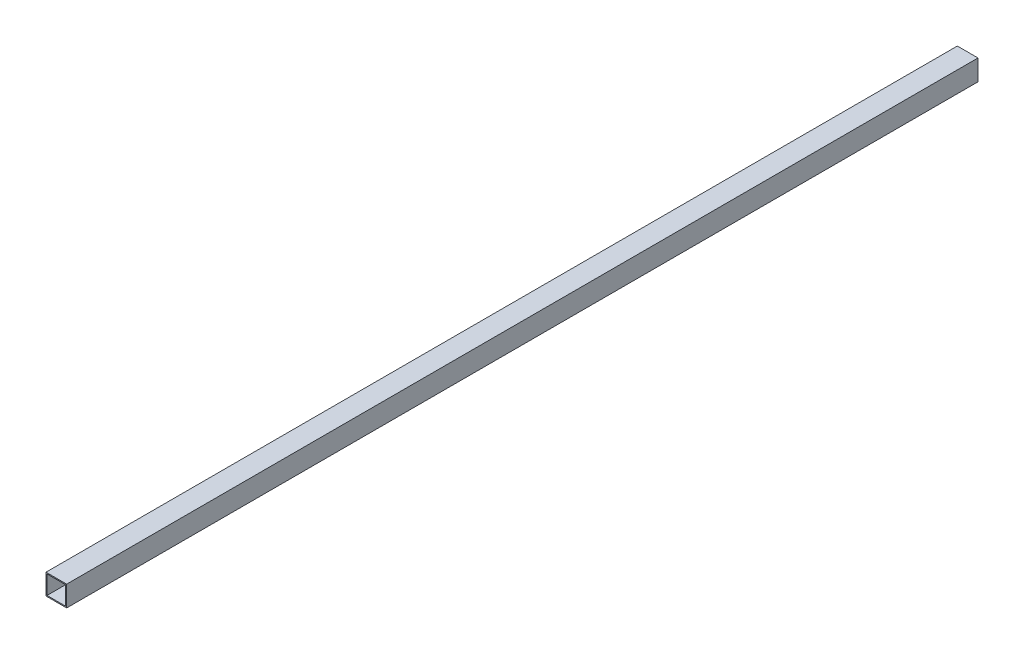
ISO-10303-21;
HEADER;
FILE_DESCRIPTION(('STEP AP214'),'2;1');
FILE_NAME('part.step','',(''),(''),'','','');
FILE_SCHEMA(('AUTOMOTIVE_DESIGN { 1 0 10303 214 1 1 1 1 }'));
ENDSEC;
DATA;
#1=APPLICATION_CONTEXT('core data for automotive mechanical design processes');
#2=APPLICATION_PROTOCOL_DEFINITION('international standard','automotive_design',2000,#1);
#3=PRODUCT_CONTEXT('',#1,'mechanical');
#4=PRODUCT('Part','Part','',(#3));
#5=PRODUCT_RELATED_PRODUCT_CATEGORY('part','',(#4));
#6=PRODUCT_DEFINITION_FORMATION('','',#4);
#7=PRODUCT_DEFINITION_CONTEXT('part definition',#1,'design');
#8=PRODUCT_DEFINITION('design','',#6,#7);
#9=PRODUCT_DEFINITION_SHAPE('','',#8);
#10=(LENGTH_UNIT() NAMED_UNIT(*) SI_UNIT(.MILLI.,.METRE.));
#11=(NAMED_UNIT(*) PLANE_ANGLE_UNIT() SI_UNIT($,.RADIAN.));
#12=(NAMED_UNIT(*) SI_UNIT($,.STERADIAN.) SOLID_ANGLE_UNIT());
#13=UNCERTAINTY_MEASURE_WITH_UNIT(LENGTH_MEASURE(1.E-05),#10,'distance_accuracy_value','');
#14=(GEOMETRIC_REPRESENTATION_CONTEXT(3) GLOBAL_UNCERTAINTY_ASSIGNED_CONTEXT((#13)) GLOBAL_UNIT_ASSIGNED_CONTEXT((#10,
#11,#12)) REPRESENTATION_CONTEXT('',''));
#15=CARTESIAN_POINT('',(0.,0.,0.));
#16=DIRECTION('',(0.,0.,1.));
#17=DIRECTION('',(1.,0.,0.));
#18=AXIS2_PLACEMENT_3D('',#15,#16,#17);
#19=CARTESIAN_POINT('',(0.,0.,1400.));
#20=DIRECTION('',(0.,0.,1.));
#21=DIRECTION('',(1.,0.,0.));
#22=AXIS2_PLACEMENT_3D('',#19,#20,#21);
#23=PLANE('',#22);
#24=DIRECTION('',(0.,1.,0.));
#25=VECTOR('',#24,1.);
#26=CARTESIAN_POINT('',(15.875,15.875,1400.));
#27=LINE('',#26,#25);
#28=CARTESIAN_POINT('',(15.875,-15.875,1400.));
#29=VERTEX_POINT('',#28);
#30=CARTESIAN_POINT('',(15.875,15.875,1400.));
#31=VERTEX_POINT('',#30);
#32=EDGE_CURVE('E134',#29,#31,#27,.T.);
#33=ORIENTED_EDGE('',*,*,#32,.T.);
#34=DIRECTION('',(-1.,0.,0.));
#35=VECTOR('',#34,1.);
#36=CARTESIAN_POINT('',(-15.875,15.875,1400.));
#37=LINE('',#36,#35);
#38=CARTESIAN_POINT('',(-15.875,15.875,1400.));
#39=VERTEX_POINT('',#38);
#40=EDGE_CURVE('E137',#31,#39,#37,.T.);
#41=ORIENTED_EDGE('',*,*,#40,.T.);
#42=DIRECTION('',(0.,-1.,0.));
#43=VECTOR('',#42,1.);
#44=CARTESIAN_POINT('',(-15.875,15.875,1400.));
#45=LINE('',#44,#43);
#46=CARTESIAN_POINT('',(-15.875,-15.875,1400.));
#47=VERTEX_POINT('',#46);
#48=EDGE_CURVE('E140',#39,#47,#45,.T.);
#49=ORIENTED_EDGE('',*,*,#48,.T.);
#50=DIRECTION('',(1.,0.,0.));
#51=VECTOR('',#50,1.);
#52=CARTESIAN_POINT('',(-15.875,-15.875,1400.));
#53=LINE('',#52,#51);
#54=EDGE_CURVE('E142',#47,#29,#53,.T.);
#55=ORIENTED_EDGE('',*,*,#54,.T.);
#56=EDGE_LOOP('',(#33,#41,#49,#55));
#57=FACE_BOUND('',#56,.T.);
#58=DIRECTION('',(-1.,0.,0.));
#59=VECTOR('',#58,1.);
#60=CARTESIAN_POINT('',(-14.2875,14.2875,1400.));
#61=LINE('',#60,#59);
#62=CARTESIAN_POINT('',(14.2875,14.2875,1400.));
#63=VERTEX_POINT('',#62);
#64=CARTESIAN_POINT('',(-14.2875,14.2875,1400.));
#65=VERTEX_POINT('',#64);
#66=EDGE_CURVE('E106',#63,#65,#61,.T.);
#67=ORIENTED_EDGE('',*,*,#66,.F.);
#68=DIRECTION('',(0.,1.,0.));
#69=VECTOR('',#68,1.);
#70=CARTESIAN_POINT('',(14.2875,14.2875,1400.));
#71=LINE('',#70,#69);
#72=CARTESIAN_POINT('',(14.2875,-14.2875,1400.));
#73=VERTEX_POINT('',#72);
#74=EDGE_CURVE('E98',#73,#63,#71,.T.);
#75=ORIENTED_EDGE('',*,*,#74,.F.);
#76=DIRECTION('',(1.,0.,0.));
#77=VECTOR('',#76,1.);
#78=CARTESIAN_POINT('',(-14.2875,-14.2875,1400.));
#79=LINE('',#78,#77);
#80=CARTESIAN_POINT('',(-14.2875,-14.2875,1400.));
#81=VERTEX_POINT('',#80);
#82=EDGE_CURVE('E120',#81,#73,#79,.T.);
#83=ORIENTED_EDGE('',*,*,#82,.F.);
#84=DIRECTION('',(0.,-1.,0.));
#85=VECTOR('',#84,1.);
#86=CARTESIAN_POINT('',(-14.2875,14.2875,1400.));
#87=LINE('',#86,#85);
#88=EDGE_CURVE('E118',#65,#81,#87,.T.);
#89=ORIENTED_EDGE('',*,*,#88,.F.);
#90=EDGE_LOOP('',(#67,#75,#83,#89));
#91=FACE_BOUND('',#90,.T.);
#92=ADVANCED_FACE('F33',(#57,#91),#23,.T.);
#93=CARTESIAN_POINT('',(0.,0.,0.));
#94=DIRECTION('',(0.,0.,1.));
#95=DIRECTION('',(1.,0.,0.));
#96=AXIS2_PLACEMENT_3D('',#93,#94,#95);
#97=PLANE('',#96);
#98=DIRECTION('',(0.,1.,0.));
#99=VECTOR('',#98,1.);
#100=CARTESIAN_POINT('',(15.875,15.875,0.));
#101=LINE('',#100,#99);
#102=CARTESIAN_POINT('',(15.875,-15.875,0.));
#103=VERTEX_POINT('',#102);
#104=CARTESIAN_POINT('',(15.875,15.875,0.));
#105=VERTEX_POINT('',#104);
#106=EDGE_CURVE('E114',#103,#105,#101,.T.);
#107=ORIENTED_EDGE('',*,*,#106,.F.);
#108=DIRECTION('',(1.,0.,0.));
#109=VECTOR('',#108,1.);
#110=CARTESIAN_POINT('',(-15.875,-15.875,0.));
#111=LINE('',#110,#109);
#112=CARTESIAN_POINT('',(-15.875,-15.875,0.));
#113=VERTEX_POINT('',#112);
#114=EDGE_CURVE('E138',#113,#103,#111,.T.);
#115=ORIENTED_EDGE('',*,*,#114,.F.);
#116=DIRECTION('',(0.,-1.,0.));
#117=VECTOR('',#116,1.);
#118=CARTESIAN_POINT('',(-15.875,15.875,0.));
#119=LINE('',#118,#117);
#120=CARTESIAN_POINT('',(-15.875,15.875,0.));
#121=VERTEX_POINT('',#120);
#122=EDGE_CURVE('E149',#121,#113,#119,.T.);
#123=ORIENTED_EDGE('',*,*,#122,.F.);
#124=DIRECTION('',(-1.,0.,0.));
#125=VECTOR('',#124,1.);
#126=CARTESIAN_POINT('',(-15.875,15.875,0.));
#127=LINE('',#126,#125);
#128=EDGE_CURVE('E147',#105,#121,#127,.T.);
#129=ORIENTED_EDGE('',*,*,#128,.F.);
#130=EDGE_LOOP('',(#107,#115,#123,#129));
#131=FACE_BOUND('',#130,.T.);
#132=DIRECTION('',(0.,1.,0.));
#133=VECTOR('',#132,1.);
#134=CARTESIAN_POINT('',(14.2875,14.2875,0.));
#135=LINE('',#134,#133);
#136=CARTESIAN_POINT('',(14.2875,-14.2875,0.));
#137=VERTEX_POINT('',#136);
#138=CARTESIAN_POINT('',(14.2875,14.2875,0.));
#139=VERTEX_POINT('',#138);
#140=EDGE_CURVE('E56',#137,#139,#135,.T.);
#141=ORIENTED_EDGE('',*,*,#140,.T.);
#142=DIRECTION('',(-1.,0.,0.));
#143=VECTOR('',#142,1.);
#144=CARTESIAN_POINT('',(-14.2875,14.2875,0.));
#145=LINE('',#144,#143);
#146=CARTESIAN_POINT('',(-14.2875,14.2875,0.));
#147=VERTEX_POINT('',#146);
#148=EDGE_CURVE('E113',#139,#147,#145,.T.);
#149=ORIENTED_EDGE('',*,*,#148,.T.);
#150=DIRECTION('',(0.,-1.,0.));
#151=VECTOR('',#150,1.);
#152=CARTESIAN_POINT('',(-14.2875,14.2875,0.));
#153=LINE('',#152,#151);
#154=CARTESIAN_POINT('',(-14.2875,-14.2875,0.));
#155=VERTEX_POINT('',#154);
#156=EDGE_CURVE('E126',#147,#155,#153,.T.);
#157=ORIENTED_EDGE('',*,*,#156,.T.);
#158=DIRECTION('',(1.,0.,0.));
#159=VECTOR('',#158,1.);
#160=CARTESIAN_POINT('',(-14.2875,-14.2875,0.));
#161=LINE('',#160,#159);
#162=EDGE_CURVE('E107',#155,#137,#161,.T.);
#163=ORIENTED_EDGE('',*,*,#162,.T.);
#164=EDGE_LOOP('',(#141,#149,#157,#163));
#165=FACE_BOUND('',#164,.T.);
#166=ADVANCED_FACE('F167',(#131,#165),#97,.F.);
#167=CARTESIAN_POINT('',(15.875,15.875,1400.));
#168=DIRECTION('',(-1.,0.,0.));
#169=DIRECTION('',(0.,-1.,0.));
#170=AXIS2_PLACEMENT_3D('',#167,#168,#169);
#171=PLANE('',#170);
#172=ORIENTED_EDGE('',*,*,#106,.T.);
#173=DIRECTION('',(0.,0.,-1.));
#174=VECTOR('',#173,1.);
#175=CARTESIAN_POINT('',(15.875,15.875,1400.));
#176=LINE('',#175,#174);
#177=EDGE_CURVE('E11',#31,#105,#176,.T.);
#178=ORIENTED_EDGE('',*,*,#177,.F.);
#179=ORIENTED_EDGE('',*,*,#32,.F.);
#180=DIRECTION('',(0.,0.,-1.));
#181=VECTOR('',#180,1.);
#182=CARTESIAN_POINT('',(15.875,-15.875,1400.));
#183=LINE('',#182,#181);
#184=EDGE_CURVE('E144',#29,#103,#183,.T.);
#185=ORIENTED_EDGE('',*,*,#184,.T.);
#186=EDGE_LOOP('',(#172,#178,#179,#185));
#187=FACE_BOUND('',#186,.T.);
#188=ADVANCED_FACE('F35',(#187),#171,.F.);
#189=CARTESIAN_POINT('',(-15.875,15.875,1400.));
#190=DIRECTION('',(0.,-1.,0.));
#191=DIRECTION('',(0.,0.,-1.));
#192=AXIS2_PLACEMENT_3D('',#189,#190,#191);
#193=PLANE('',#192);
#194=ORIENTED_EDGE('',*,*,#128,.T.);
#195=DIRECTION('',(0.,0.,-1.));
#196=VECTOR('',#195,1.);
#197=CARTESIAN_POINT('',(-15.875,15.875,1400.));
#198=LINE('',#197,#196);
#199=EDGE_CURVE('E41',#39,#121,#198,.T.);
#200=ORIENTED_EDGE('',*,*,#199,.F.);
#201=ORIENTED_EDGE('',*,*,#40,.F.);
#202=ORIENTED_EDGE('',*,*,#177,.T.);
#203=EDGE_LOOP('',(#194,#200,#201,#202));
#204=FACE_BOUND('',#203,.T.);
#205=ADVANCED_FACE('F177',(#204),#193,.F.);
#206=CARTESIAN_POINT('',(-15.875,15.875,1400.));
#207=DIRECTION('',(1.,0.,0.));
#208=DIRECTION('',(0.,0.,-1.));
#209=AXIS2_PLACEMENT_3D('',#206,#207,#208);
#210=PLANE('',#209);
#211=ORIENTED_EDGE('',*,*,#122,.T.);
#212=DIRECTION('',(0.,0.,-1.));
#213=VECTOR('',#212,1.);
#214=CARTESIAN_POINT('',(-15.875,-15.875,1400.));
#215=LINE('',#214,#213);
#216=EDGE_CURVE('E154',#47,#113,#215,.T.);
#217=ORIENTED_EDGE('',*,*,#216,.F.);
#218=ORIENTED_EDGE('',*,*,#48,.F.);
#219=ORIENTED_EDGE('',*,*,#199,.T.);
#220=EDGE_LOOP('',(#211,#217,#218,#219));
#221=FACE_BOUND('',#220,.T.);
#222=ADVANCED_FACE('F161',(#221),#210,.F.);
#223=CARTESIAN_POINT('',(-15.875,-15.875,1400.));
#224=DIRECTION('',(0.,1.,0.));
#225=DIRECTION('',(0.,0.,1.));
#226=AXIS2_PLACEMENT_3D('',#223,#224,#225);
#227=PLANE('',#226);
#228=ORIENTED_EDGE('',*,*,#114,.T.);
#229=ORIENTED_EDGE('',*,*,#184,.F.);
#230=ORIENTED_EDGE('',*,*,#54,.F.);
#231=ORIENTED_EDGE('',*,*,#216,.T.);
#232=EDGE_LOOP('',(#228,#229,#230,#231));
#233=FACE_BOUND('',#232,.T.);
#234=ADVANCED_FACE('F171',(#233),#227,.F.);
#235=CARTESIAN_POINT('',(14.2875,14.2875,1400.));
#236=DIRECTION('',(-1.,0.,0.));
#237=DIRECTION('',(0.,0.,1.));
#238=AXIS2_PLACEMENT_3D('',#235,#236,#237);
#239=PLANE('',#238);
#240=ORIENTED_EDGE('',*,*,#140,.F.);
#241=DIRECTION('',(0.,0.,-1.));
#242=VECTOR('',#241,1.);
#243=CARTESIAN_POINT('',(14.2875,-14.2875,1400.));
#244=LINE('',#243,#242);
#245=EDGE_CURVE('E102',#73,#137,#244,.T.);
#246=ORIENTED_EDGE('',*,*,#245,.F.);
#247=ORIENTED_EDGE('',*,*,#74,.T.);
#248=DIRECTION('',(0.,0.,-1.));
#249=VECTOR('',#248,1.);
#250=CARTESIAN_POINT('',(14.2875,14.2875,1400.));
#251=LINE('',#250,#249);
#252=EDGE_CURVE('E101',#63,#139,#251,.T.);
#253=ORIENTED_EDGE('',*,*,#252,.T.);
#254=EDGE_LOOP('',(#240,#246,#247,#253));
#255=FACE_BOUND('',#254,.T.);
#256=ADVANCED_FACE('F100',(#255),#239,.T.);
#257=CARTESIAN_POINT('',(-14.2875,14.2875,1400.));
#258=DIRECTION('',(0.,-1.,0.));
#259=DIRECTION('',(0.,0.,-1.));
#260=AXIS2_PLACEMENT_3D('',#257,#258,#259);
#261=PLANE('',#260);
#262=ORIENTED_EDGE('',*,*,#148,.F.);
#263=ORIENTED_EDGE('',*,*,#252,.F.);
#264=ORIENTED_EDGE('',*,*,#66,.T.);
#265=DIRECTION('',(0.,0.,-1.));
#266=VECTOR('',#265,1.);
#267=CARTESIAN_POINT('',(-14.2875,14.2875,1400.));
#268=LINE('',#267,#266);
#269=EDGE_CURVE('E115',#65,#147,#268,.T.);
#270=ORIENTED_EDGE('',*,*,#269,.T.);
#271=EDGE_LOOP('',(#262,#263,#264,#270));
#272=FACE_BOUND('',#271,.T.);
#273=ADVANCED_FACE('F110',(#272),#261,.T.);
#274=CARTESIAN_POINT('',(-14.2875,14.2875,1400.));
#275=DIRECTION('',(1.,0.,0.));
#276=DIRECTION('',(0.,0.,-1.));
#277=AXIS2_PLACEMENT_3D('',#274,#275,#276);
#278=PLANE('',#277);
#279=ORIENTED_EDGE('',*,*,#156,.F.);
#280=ORIENTED_EDGE('',*,*,#269,.F.);
#281=ORIENTED_EDGE('',*,*,#88,.T.);
#282=DIRECTION('',(0.,0.,-1.));
#283=VECTOR('',#282,1.);
#284=CARTESIAN_POINT('',(-14.2875,-14.2875,1400.));
#285=LINE('',#284,#283);
#286=EDGE_CURVE('E48',#81,#155,#285,.T.);
#287=ORIENTED_EDGE('',*,*,#286,.T.);
#288=EDGE_LOOP('',(#279,#280,#281,#287));
#289=FACE_BOUND('',#288,.T.);
#290=ADVANCED_FACE('F200',(#289),#278,.T.);
#291=CARTESIAN_POINT('',(-14.2875,-14.2875,1400.));
#292=DIRECTION('',(0.,1.,0.));
#293=DIRECTION('',(0.,0.,1.));
#294=AXIS2_PLACEMENT_3D('',#291,#292,#293);
#295=PLANE('',#294);
#296=ORIENTED_EDGE('',*,*,#162,.F.);
#297=ORIENTED_EDGE('',*,*,#286,.F.);
#298=ORIENTED_EDGE('',*,*,#82,.T.);
#299=ORIENTED_EDGE('',*,*,#245,.T.);
#300=EDGE_LOOP('',(#296,#297,#298,#299));
#301=FACE_BOUND('',#300,.T.);
#302=ADVANCED_FACE('F204',(#301),#295,.T.);
#303=CLOSED_SHELL('',(#92,#166,#188,#205,#222,#234,#256,#273,#290,#302));
#304=MANIFOLD_SOLID_BREP('B2',#303);
#305=ADVANCED_BREP_SHAPE_REPRESENTATION('',(#18,#304),#14);
#306=SHAPE_DEFINITION_REPRESENTATION(#9,#305);
ENDSEC;
END-ISO-10303-21;
